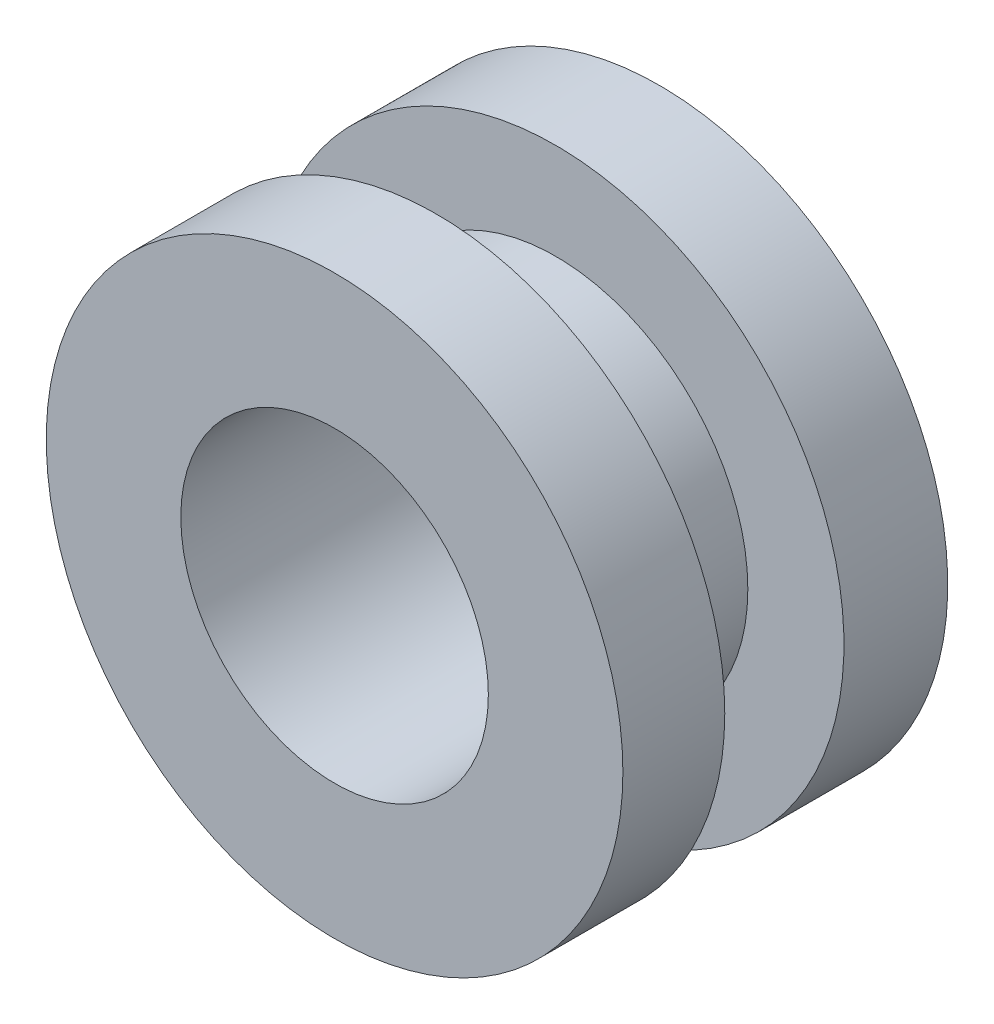
ISO-10303-21;
HEADER;
FILE_DESCRIPTION(('STEP AP214'),'2;1');
FILE_NAME('part.step','',(''),(''),'','','');
FILE_SCHEMA(('AUTOMOTIVE_DESIGN { 1 0 10303 214 1 1 1 1 }'));
ENDSEC;
DATA;
#1=APPLICATION_CONTEXT('core data for automotive mechanical design processes');
#2=APPLICATION_PROTOCOL_DEFINITION('international standard','automotive_design',2000,#1);
#3=PRODUCT_CONTEXT('',#1,'mechanical');
#4=PRODUCT('Part','Part','',(#3));
#5=PRODUCT_RELATED_PRODUCT_CATEGORY('part','',(#4));
#6=PRODUCT_DEFINITION_FORMATION('','',#4);
#7=PRODUCT_DEFINITION_CONTEXT('part definition',#1,'design');
#8=PRODUCT_DEFINITION('design','',#6,#7);
#9=PRODUCT_DEFINITION_SHAPE('','',#8);
#10=(LENGTH_UNIT() NAMED_UNIT(*) SI_UNIT(.MILLI.,.METRE.));
#11=(NAMED_UNIT(*) PLANE_ANGLE_UNIT() SI_UNIT($,.RADIAN.));
#12=(NAMED_UNIT(*) SI_UNIT($,.STERADIAN.) SOLID_ANGLE_UNIT());
#13=UNCERTAINTY_MEASURE_WITH_UNIT(LENGTH_MEASURE(1.E-05),#10,'distance_accuracy_value','');
#14=(GEOMETRIC_REPRESENTATION_CONTEXT(3) GLOBAL_UNCERTAINTY_ASSIGNED_CONTEXT((#13)) GLOBAL_UNIT_ASSIGNED_CONTEXT((#10,
#11,#12)) REPRESENTATION_CONTEXT('',''));
#15=CARTESIAN_POINT('',(0.,0.,0.));
#16=DIRECTION('',(0.,0.,1.));
#17=DIRECTION('',(1.,0.,0.));
#18=AXIS2_PLACEMENT_3D('',#15,#16,#17);
#19=CARTESIAN_POINT('',(0.,0.,3.1));
#20=DIRECTION('',(0.,0.,-1.));
#21=DIRECTION('',(-1.,0.,0.));
#22=AXIS2_PLACEMENT_3D('',#19,#20,#21);
#23=CYLINDRICAL_SURFACE('',#22,5.);
#24=CARTESIAN_POINT('',(0.,0.,3.1));
#25=DIRECTION('',(0.,0.,1.));
#26=DIRECTION('',(1.,0.,0.));
#27=AXIS2_PLACEMENT_3D('',#24,#25,#26);
#28=CIRCLE('',#27,5.);
#29=CARTESIAN_POINT('',(5.,0.,3.1));
#30=VERTEX_POINT('',#29);
#31=EDGE_CURVE('E10',#30,#30,#28,.T.);
#32=ORIENTED_EDGE('',*,*,#31,.F.);
#33=EDGE_LOOP('',(#32));
#34=FACE_BOUND('',#33,.T.);
#35=CARTESIAN_POINT('',(0.,0.,0.));
#36=DIRECTION('',(0.,0.,1.));
#37=DIRECTION('',(1.,0.,0.));
#38=AXIS2_PLACEMENT_3D('',#35,#36,#37);
#39=CIRCLE('',#38,5.);
#40=CARTESIAN_POINT('',(5.,0.,0.));
#41=VERTEX_POINT('',#40);
#42=EDGE_CURVE('E18',#41,#41,#39,.T.);
#43=ORIENTED_EDGE('',*,*,#42,.T.);
#44=EDGE_LOOP('',(#43));
#45=FACE_BOUND('',#44,.T.);
#46=ADVANCED_FACE('F15',(#34,#45),#23,.T.);
#47=CARTESIAN_POINT('',(0.,0.,3.1));
#48=DIRECTION('',(0.,0.,-1.));
#49=DIRECTION('',(-1.,0.,0.));
#50=AXIS2_PLACEMENT_3D('',#47,#48,#49);
#51=CYLINDRICAL_SURFACE('',#50,4.);
#52=CARTESIAN_POINT('',(0.,0.,5.75));
#53=DIRECTION('',(0.,0.,1.));
#54=DIRECTION('',(1.,0.,0.));
#55=AXIS2_PLACEMENT_3D('',#52,#53,#54);
#56=CIRCLE('',#55,4.);
#57=CARTESIAN_POINT('',(4.,0.,5.75));
#58=VERTEX_POINT('',#57);
#59=EDGE_CURVE('E30',#58,#58,#56,.T.);
#60=ORIENTED_EDGE('',*,*,#59,.T.);
#61=EDGE_LOOP('',(#60));
#62=FACE_BOUND('',#61,.T.);
#63=CARTESIAN_POINT('',(0.,0.,-2.7));
#64=DIRECTION('',(0.,0.,-1.));
#65=DIRECTION('',(-1.,0.,0.));
#66=AXIS2_PLACEMENT_3D('',#63,#64,#65);
#67=CIRCLE('',#66,4.);
#68=CARTESIAN_POINT('',(-4.,0.,-2.7));
#69=VERTEX_POINT('',#68);
#70=EDGE_CURVE('E38',#69,#69,#67,.T.);
#71=ORIENTED_EDGE('',*,*,#70,.T.);
#72=EDGE_LOOP('',(#71));
#73=FACE_BOUND('',#72,.T.);
#74=ADVANCED_FACE('F44',(#62,#73),#51,.F.);
#75=CARTESIAN_POINT('',(0.,0.,5.75));
#76=DIRECTION('',(0.,0.,1.));
#77=DIRECTION('',(1.,0.,0.));
#78=AXIS2_PLACEMENT_3D('',#75,#76,#77);
#79=PLANE('',#78);
#80=CARTESIAN_POINT('',(0.,0.,5.75));
#81=DIRECTION('',(0.,0.,1.));
#82=DIRECTION('',(1.,0.,0.));
#83=AXIS2_PLACEMENT_3D('',#80,#81,#82);
#84=CIRCLE('',#83,7.5);
#85=CARTESIAN_POINT('',(7.5,0.,5.75));
#86=VERTEX_POINT('',#85);
#87=EDGE_CURVE('E22',#86,#86,#84,.T.);
#88=ORIENTED_EDGE('',*,*,#87,.T.);
#89=EDGE_LOOP('',(#88));
#90=FACE_BOUND('',#89,.T.);
#91=ORIENTED_EDGE('',*,*,#59,.F.);
#92=EDGE_LOOP('',(#91));
#93=FACE_BOUND('',#92,.T.);
#94=ADVANCED_FACE('F70',(#90,#93),#79,.T.);
#95=CARTESIAN_POINT('',(0.,0.,3.1));
#96=DIRECTION('',(0.,0.,1.));
#97=DIRECTION('',(1.,0.,0.));
#98=AXIS2_PLACEMENT_3D('',#95,#96,#97);
#99=PLANE('',#98);
#100=ORIENTED_EDGE('',*,*,#31,.T.);
#101=EDGE_LOOP('',(#100));
#102=FACE_BOUND('',#101,.T.);
#103=CARTESIAN_POINT('',(0.,0.,3.1));
#104=DIRECTION('',(0.,0.,1.));
#105=DIRECTION('',(1.,0.,0.));
#106=AXIS2_PLACEMENT_3D('',#103,#104,#105);
#107=CIRCLE('',#106,7.5);
#108=CARTESIAN_POINT('',(7.5,0.,3.1));
#109=VERTEX_POINT('',#108);
#110=EDGE_CURVE('E26',#109,#109,#107,.T.);
#111=ORIENTED_EDGE('',*,*,#110,.F.);
#112=EDGE_LOOP('',(#111));
#113=FACE_BOUND('',#112,.T.);
#114=ADVANCED_FACE('F61',(#102,#113),#99,.F.);
#115=CARTESIAN_POINT('',(0.,0.,5.75));
#116=DIRECTION('',(0.,0.,-1.));
#117=DIRECTION('',(-1.,0.,0.));
#118=AXIS2_PLACEMENT_3D('',#115,#116,#117);
#119=CYLINDRICAL_SURFACE('',#118,7.5);
#120=ORIENTED_EDGE('',*,*,#87,.F.);
#121=EDGE_LOOP('',(#120));
#122=FACE_BOUND('',#121,.T.);
#123=ORIENTED_EDGE('',*,*,#110,.T.);
#124=EDGE_LOOP('',(#123));
#125=FACE_BOUND('',#124,.T.);
#126=ADVANCED_FACE('F49',(#122,#125),#119,.T.);
#127=CARTESIAN_POINT('',(0.,0.,-2.7));
#128=DIRECTION('',(0.,0.,-1.));
#129=DIRECTION('',(-1.,0.,0.));
#130=AXIS2_PLACEMENT_3D('',#127,#128,#129);
#131=PLANE('',#130);
#132=CARTESIAN_POINT('',(0.,0.,-2.7));
#133=DIRECTION('',(0.,0.,-1.));
#134=DIRECTION('',(-1.,0.,0.));
#135=AXIS2_PLACEMENT_3D('',#132,#133,#134);
#136=CIRCLE('',#135,7.5);
#137=CARTESIAN_POINT('',(-7.5,0.,-2.7));
#138=VERTEX_POINT('',#137);
#139=EDGE_CURVE('E37',#138,#138,#136,.T.);
#140=ORIENTED_EDGE('',*,*,#139,.T.);
#141=EDGE_LOOP('',(#140));
#142=FACE_BOUND('',#141,.T.);
#143=ORIENTED_EDGE('',*,*,#70,.F.);
#144=EDGE_LOOP('',(#143));
#145=FACE_BOUND('',#144,.T.);
#146=ADVANCED_FACE('F46',(#142,#145),#131,.T.);
#147=CARTESIAN_POINT('',(0.,0.,0.));
#148=DIRECTION('',(0.,0.,-1.));
#149=DIRECTION('',(-1.,0.,0.));
#150=AXIS2_PLACEMENT_3D('',#147,#148,#149);
#151=PLANE('',#150);
#152=ORIENTED_EDGE('',*,*,#42,.F.);
#153=EDGE_LOOP('',(#152));
#154=FACE_BOUND('',#153,.T.);
#155=CARTESIAN_POINT('',(0.,0.,0.));
#156=DIRECTION('',(0.,0.,-1.));
#157=DIRECTION('',(-1.,0.,0.));
#158=AXIS2_PLACEMENT_3D('',#155,#156,#157);
#159=CIRCLE('',#158,7.5);
#160=CARTESIAN_POINT('',(-7.5,0.,0.));
#161=VERTEX_POINT('',#160);
#162=EDGE_CURVE('E34',#161,#161,#159,.T.);
#163=ORIENTED_EDGE('',*,*,#162,.F.);
#164=EDGE_LOOP('',(#163));
#165=FACE_BOUND('',#164,.T.);
#166=ADVANCED_FACE('F48',(#154,#165),#151,.F.);
#167=CARTESIAN_POINT('',(0.,0.,-2.7));
#168=DIRECTION('',(0.,0.,1.));
#169=DIRECTION('',(1.,0.,0.));
#170=AXIS2_PLACEMENT_3D('',#167,#168,#169);
#171=CYLINDRICAL_SURFACE('',#170,7.5);
#172=ORIENTED_EDGE('',*,*,#139,.F.);
#173=EDGE_LOOP('',(#172));
#174=FACE_BOUND('',#173,.T.);
#175=ORIENTED_EDGE('',*,*,#162,.T.);
#176=EDGE_LOOP('',(#175));
#177=FACE_BOUND('',#176,.T.);
#178=ADVANCED_FACE('F58',(#174,#177),#171,.T.);
#179=CLOSED_SHELL('',(#46,#74,#94,#114,#126,#146,#166,#178));
#180=MANIFOLD_SOLID_BREP('B1',#179);
#181=ADVANCED_BREP_SHAPE_REPRESENTATION('',(#18,#180),#14);
#182=SHAPE_DEFINITION_REPRESENTATION(#9,#181);
ENDSEC;
END-ISO-10303-21;
